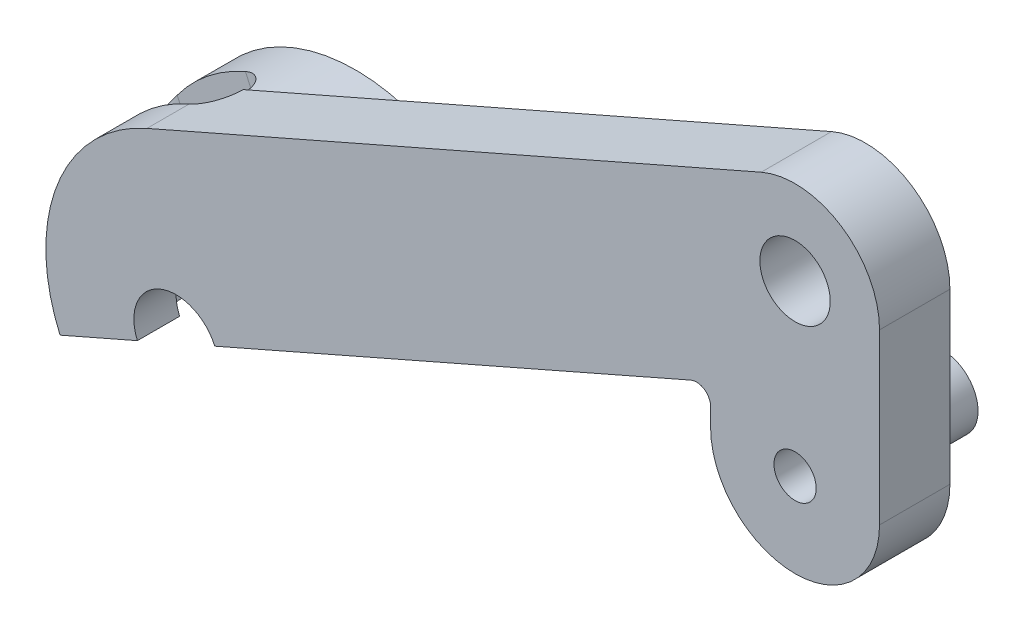
ISO-10303-21;
HEADER;
FILE_DESCRIPTION(('STEP AP214'),'2;1');
FILE_NAME('part.step','',(''),(''),'','','');
FILE_SCHEMA(('AUTOMOTIVE_DESIGN { 1 0 10303 214 1 1 1 1 }'));
ENDSEC;
DATA;
#1=APPLICATION_CONTEXT('core data for automotive mechanical design processes');
#2=APPLICATION_PROTOCOL_DEFINITION('international standard','automotive_design',2000,#1);
#3=PRODUCT_CONTEXT('',#1,'mechanical');
#4=PRODUCT('Part','Part','',(#3));
#5=PRODUCT_RELATED_PRODUCT_CATEGORY('part','',(#4));
#6=PRODUCT_DEFINITION_FORMATION('','',#4);
#7=PRODUCT_DEFINITION_CONTEXT('part definition',#1,'design');
#8=PRODUCT_DEFINITION('design','',#6,#7);
#9=PRODUCT_DEFINITION_SHAPE('','',#8);
#10=(LENGTH_UNIT() NAMED_UNIT(*) SI_UNIT(.MILLI.,.METRE.));
#11=(NAMED_UNIT(*) PLANE_ANGLE_UNIT() SI_UNIT($,.RADIAN.));
#12=(NAMED_UNIT(*) SI_UNIT($,.STERADIAN.) SOLID_ANGLE_UNIT());
#13=UNCERTAINTY_MEASURE_WITH_UNIT(LENGTH_MEASURE(1.E-05),#10,'distance_accuracy_value','');
#14=(GEOMETRIC_REPRESENTATION_CONTEXT(3) GLOBAL_UNCERTAINTY_ASSIGNED_CONTEXT((#13)) GLOBAL_UNIT_ASSIGNED_CONTEXT((#10,
#11,#12)) REPRESENTATION_CONTEXT('',''));
#15=CARTESIAN_POINT('',(0.,0.,0.));
#16=DIRECTION('',(0.,0.,1.));
#17=DIRECTION('',(1.,0.,0.));
#18=AXIS2_PLACEMENT_3D('',#15,#16,#17);
#19=CARTESIAN_POINT('',(0.,0.,0.));
#20=DIRECTION('',(0.,0.,1.));
#21=DIRECTION('',(1.,0.,0.));
#22=AXIS2_PLACEMENT_3D('',#19,#20,#21);
#23=PLANE('',#22);
#24=CARTESIAN_POINT('',(-41.2219418290661,-24.6147665054727,0.));
#25=DIRECTION('',(0.,0.,-1.));
#26=DIRECTION('',(-1.,0.,0.));
#27=AXIS2_PLACEMENT_3D('',#24,#25,#26);
#28=CIRCLE('',#27,12.);
#29=CARTESIAN_POINT('',(-44.1391367300986,-12.9747504440838,0.));
#30=VERTEX_POINT('',#29);
#31=CARTESIAN_POINT('',(-30.230930363282,-19.7983708656813,0.));
#32=VERTEX_POINT('',#31);
#33=EDGE_CURVE('E220',#30,#32,#28,.T.);
#34=ORIENTED_EDGE('',*,*,#33,.F.);
#35=DIRECTION('',(-0.401366303315951,0.915917622148678,0.));
#36=VECTOR('',#35,1.);
#37=CARTESIAN_POINT('',(-37.784641371505,-27.4757043874355,0.));
#38=LINE('',#37,#36);
#39=CARTESIAN_POINT('',(-44.2065022245602,-12.8210224330566,0.));
#40=VERTEX_POINT('',#39);
#41=EDGE_CURVE('E327',#30,#40,#38,.T.);
#42=ORIENTED_EDGE('',*,*,#41,.T.);
#43=DIRECTION('',(-0.915917622148678,-0.401366303315951,0.));
#44=VECTOR('',#43,1.);
#45=CARTESIAN_POINT('',(-2.40819781989571,5.49550573289207,0.));
#46=LINE('',#45,#44);
#47=CARTESIAN_POINT('',(-2.40819781989571,5.49550573289207,0.));
#48=VERTEX_POINT('',#47);
#49=EDGE_CURVE('E165',#48,#40,#46,.T.);
#50=ORIENTED_EDGE('',*,*,#49,.F.);
#51=CARTESIAN_POINT('',(0.,0.,0.));
#52=DIRECTION('',(0.,0.,1.));
#53=DIRECTION('',(1.,0.,0.));
#54=AXIS2_PLACEMENT_3D('',#51,#52,#53);
#55=CIRCLE('',#54,6.);
#56=CARTESIAN_POINT('',(6.,0.,0.));
#57=VERTEX_POINT('',#56);
#58=EDGE_CURVE('E250',#57,#48,#55,.T.);
#59=ORIENTED_EDGE('',*,*,#58,.F.);
#60=DIRECTION('',(0.,1.,0.));
#61=VECTOR('',#60,1.);
#62=CARTESIAN_POINT('',(6.,0.,0.));
#63=LINE('',#62,#61);
#64=CARTESIAN_POINT('',(5.99999999999999,-12.,0.));
#65=VERTEX_POINT('',#64);
#66=EDGE_CURVE('E257',#65,#57,#63,.T.);
#67=ORIENTED_EDGE('',*,*,#66,.F.);
#68=CARTESIAN_POINT('',(0.,-12.,0.));
#69=DIRECTION('',(0.,0.,1.));
#70=DIRECTION('',(1.,0.,0.));
#71=AXIS2_PLACEMENT_3D('',#68,#69,#70);
#72=CIRCLE('',#71,5.99999999999999);
#73=CARTESIAN_POINT('',(-5.99999999999999,-12.0000000000001,0.));
#74=VERTEX_POINT('',#73);
#75=EDGE_CURVE('E284',#74,#65,#72,.T.);
#76=ORIENTED_EDGE('',*,*,#75,.F.);
#77=DIRECTION('',(0.,-1.,0.));
#78=VECTOR('',#77,1.);
#79=CARTESIAN_POINT('',(-5.99999999999999,-10.7100943207089,0.));
#80=LINE('',#79,#78);
#81=CARTESIAN_POINT('',(-5.99999999999999,-10.7100943207089,0.));
#82=VERTEX_POINT('',#81);
#83=EDGE_CURVE('E282',#82,#74,#80,.T.);
#84=ORIENTED_EDGE('',*,*,#83,.F.);
#85=CARTESIAN_POINT('',(-6.99999999999999,-10.7100943207088,0.));
#86=DIRECTION('',(0.,0.,-1.));
#87=DIRECTION('',(1.,0.,0.));
#88=AXIS2_PLACEMENT_3D('',#85,#86,#87);
#89=CIRCLE('',#88,1.);
#90=CARTESIAN_POINT('',(-7.40136630331595,-9.79417669856016,0.));
#91=VERTEX_POINT('',#90);
#92=EDGE_CURVE('E280',#91,#82,#89,.T.);
#93=ORIENTED_EDGE('',*,*,#92,.F.);
#94=DIRECTION('',(0.915917622148678,0.40136630331595,0.));
#95=VECTOR('',#94,1.);
#96=CARTESIAN_POINT('',(-7.40136630331595,-9.79417669856016,0.));
#97=LINE('',#96,#95);
#98=EDGE_CURVE('E278',#32,#91,#97,.T.);
#99=ORIENTED_EDGE('',*,*,#98,.F.);
#100=EDGE_LOOP('',(#34,#42,#50,#59,#67,#76,#84,#93,#99));
#101=FACE_BOUND('',#100,.T.);
#102=CARTESIAN_POINT('',(0.,0.,0.));
#103=DIRECTION('',(0.,0.,1.));
#104=DIRECTION('',(1.,0.,0.));
#105=AXIS2_PLACEMENT_3D('',#102,#103,#104);
#106=CIRCLE('',#105,2.5);
#107=CARTESIAN_POINT('',(2.5,0.,0.));
#108=VERTEX_POINT('',#107);
#109=EDGE_CURVE('E246',#108,#108,#106,.T.);
#110=ORIENTED_EDGE('',*,*,#109,.T.);
#111=EDGE_LOOP('',(#110));
#112=FACE_BOUND('',#111,.T.);
#113=CARTESIAN_POINT('',(0.,-12.,0.));
#114=DIRECTION('',(0.,0.,1.));
#115=DIRECTION('',(1.,0.,0.));
#116=AXIS2_PLACEMENT_3D('',#113,#114,#115);
#117=CIRCLE('',#116,3.5);
#118=CARTESIAN_POINT('',(3.5,-12.,0.));
#119=VERTEX_POINT('',#118);
#120=EDGE_CURVE('E11',#119,#119,#117,.F.);
#121=ORIENTED_EDGE('',*,*,#120,.F.);
#122=EDGE_LOOP('',(#121));
#123=FACE_BOUND('',#122,.T.);
#124=ADVANCED_FACE('F30',(#101,#112,#123),#23,.F.);
#125=CARTESIAN_POINT('',(-43.9696946955122,-25.8188654154205,5.));
#126=DIRECTION('',(0.,0.,-1.));
#127=DIRECTION('',(-1.,0.,0.));
#128=AXIS2_PLACEMENT_3D('',#125,#126,#127);
#129=CYLINDRICAL_SURFACE('',#128,3.);
#130=DIRECTION('',(0.,0.,-1.));
#131=VECTOR('',#130,1.);
#132=CARTESIAN_POINT('',(-46.7174475619582,-27.0229643253684,5.));
#133=LINE('',#132,#131);
#134=CARTESIAN_POINT('',(-46.7174475619582,-27.0229643253684,5.));
#135=VERTEX_POINT('',#134);
#136=CARTESIAN_POINT('',(-46.7174475619582,-27.0229643253684,2.));
#137=VERTEX_POINT('',#136);
#138=EDGE_CURVE('E176',#135,#137,#133,.T.);
#139=ORIENTED_EDGE('',*,*,#138,.T.);
#140=CARTESIAN_POINT('',(-43.9696946955122,-25.8188654154205,2.));
#141=DIRECTION('',(0.,0.,1.));
#142=DIRECTION('',(1.,0.,0.));
#143=AXIS2_PLACEMENT_3D('',#140,#141,#142);
#144=CIRCLE('',#143,3.);
#145=CARTESIAN_POINT('',(-41.2219418290661,-24.6147665054727,2.));
#146=VERTEX_POINT('',#145);
#147=EDGE_CURVE('E149',#137,#146,#144,.F.);
#148=ORIENTED_EDGE('',*,*,#147,.T.);
#149=DIRECTION('',(0.,0.,-1.));
#150=VECTOR('',#149,1.);
#151=CARTESIAN_POINT('',(-41.2219418290661,-24.6147665054727,5.));
#152=LINE('',#151,#150);
#153=CARTESIAN_POINT('',(-41.2219418290661,-24.6147665054727,5.));
#154=VERTEX_POINT('',#153);
#155=EDGE_CURVE('E188',#154,#146,#152,.T.);
#156=ORIENTED_EDGE('',*,*,#155,.F.);
#157=CARTESIAN_POINT('',(-43.9696946955122,-25.8188654154205,5.));
#158=DIRECTION('',(0.,0.,-1.));
#159=DIRECTION('',(1.,0.,0.));
#160=AXIS2_PLACEMENT_3D('',#157,#158,#159);
#161=CIRCLE('',#160,3.);
#162=EDGE_CURVE('E262',#135,#154,#161,.T.);
#163=ORIENTED_EDGE('',*,*,#162,.F.);
#164=EDGE_LOOP('',(#139,#148,#156,#163));
#165=FACE_BOUND('',#164,.T.);
#166=ADVANCED_FACE('F366',(#165),#129,.F.);
#167=CARTESIAN_POINT('',(0.,0.,5.));
#168=DIRECTION('',(0.,0.,1.));
#169=DIRECTION('',(1.,0.,0.));
#170=AXIS2_PLACEMENT_3D('',#167,#168,#169);
#171=PLANE('',#170);
#172=CARTESIAN_POINT('',(0.,-12.,5.));
#173=DIRECTION('',(0.,0.,1.));
#174=DIRECTION('',(1.,0.,0.));
#175=AXIS2_PLACEMENT_3D('',#172,#173,#174);
#176=CIRCLE('',#175,1.5);
#177=CARTESIAN_POINT('',(1.5,-12.,5.));
#178=VERTEX_POINT('',#177);
#179=EDGE_CURVE('E240',#178,#178,#176,.T.);
#180=ORIENTED_EDGE('',*,*,#179,.F.);
#181=EDGE_LOOP('',(#180));
#182=FACE_BOUND('',#181,.T.);
#183=CARTESIAN_POINT('',(0.,0.,5.));
#184=DIRECTION('',(0.,0.,1.));
#185=DIRECTION('',(1.,0.,0.));
#186=AXIS2_PLACEMENT_3D('',#183,#184,#185);
#187=CIRCLE('',#186,6.);
#188=CARTESIAN_POINT('',(6.,0.,5.));
#189=VERTEX_POINT('',#188);
#190=CARTESIAN_POINT('',(-2.40819781989571,5.49550573289207,5.));
#191=VERTEX_POINT('',#190);
#192=EDGE_CURVE('E253',#189,#191,#187,.T.);
#193=ORIENTED_EDGE('',*,*,#192,.T.);
#194=DIRECTION('',(-0.915917622148678,-0.401366303315951,0.));
#195=VECTOR('',#194,1.);
#196=CARTESIAN_POINT('',(-2.40819781989571,5.49550573289207,5.));
#197=LINE('',#196,#195);
#198=CARTESIAN_POINT('',(-46.0383374688576,-13.6237550396885,5.));
#199=VERTEX_POINT('',#198);
#200=EDGE_CURVE('E256',#191,#199,#197,.T.);
#201=ORIENTED_EDGE('',*,*,#200,.T.);
#202=CARTESIAN_POINT('',(-41.2219418290661,-24.6147665054727,5.));
#203=DIRECTION('',(0.,0.,1.));
#204=DIRECTION('',(1.,0.,0.));
#205=AXIS2_PLACEMENT_3D('',#202,#203,#204);
#206=CIRCLE('',#205,12.);
#207=CARTESIAN_POINT('',(-52.2129532948503,-29.4311621452641,5.));
#208=VERTEX_POINT('',#207);
#209=EDGE_CURVE('E171',#199,#208,#206,.T.);
#210=ORIENTED_EDGE('',*,*,#209,.T.);
#211=DIRECTION('',(0.915917622148679,0.401366303315949,0.));
#212=VECTOR('',#211,1.);
#213=CARTESIAN_POINT('',(-46.7174475619582,-27.0229643253684,5.));
#214=LINE('',#213,#212);
#215=EDGE_CURVE('E260',#208,#135,#214,.T.);
#216=ORIENTED_EDGE('',*,*,#215,.T.);
#217=ORIENTED_EDGE('',*,*,#162,.T.);
#218=DIRECTION('',(0.915917622148678,0.40136630331595,0.));
#219=VECTOR('',#218,1.);
#220=CARTESIAN_POINT('',(-7.40136630331595,-9.79417669856016,5.));
#221=LINE('',#220,#219);
#222=CARTESIAN_POINT('',(-7.40136630331595,-9.79417669856016,5.));
#223=VERTEX_POINT('',#222);
#224=EDGE_CURVE('E264',#154,#223,#221,.T.);
#225=ORIENTED_EDGE('',*,*,#224,.T.);
#226=CARTESIAN_POINT('',(-6.99999999999999,-10.7100943207088,5.));
#227=DIRECTION('',(0.,0.,-1.));
#228=DIRECTION('',(1.,0.,0.));
#229=AXIS2_PLACEMENT_3D('',#226,#227,#228);
#230=CIRCLE('',#229,1.);
#231=CARTESIAN_POINT('',(-5.99999999999999,-10.7100943207089,5.));
#232=VERTEX_POINT('',#231);
#233=EDGE_CURVE('E266',#223,#232,#230,.T.);
#234=ORIENTED_EDGE('',*,*,#233,.T.);
#235=DIRECTION('',(0.,-1.,0.));
#236=VECTOR('',#235,1.);
#237=CARTESIAN_POINT('',(-5.99999999999999,-10.7100943207089,5.));
#238=LINE('',#237,#236);
#239=CARTESIAN_POINT('',(-5.99999999999999,-12.0000000000001,5.));
#240=VERTEX_POINT('',#239);
#241=EDGE_CURVE('E268',#232,#240,#238,.T.);
#242=ORIENTED_EDGE('',*,*,#241,.T.);
#243=CARTESIAN_POINT('',(0.,-12.,5.));
#244=DIRECTION('',(0.,0.,1.));
#245=DIRECTION('',(1.,0.,0.));
#246=AXIS2_PLACEMENT_3D('',#243,#244,#245);
#247=CIRCLE('',#246,5.99999999999999);
#248=CARTESIAN_POINT('',(5.99999999999999,-12.,5.));
#249=VERTEX_POINT('',#248);
#250=EDGE_CURVE('E270',#240,#249,#247,.T.);
#251=ORIENTED_EDGE('',*,*,#250,.T.);
#252=DIRECTION('',(0.,1.,0.));
#253=VECTOR('',#252,1.);
#254=CARTESIAN_POINT('',(6.,0.,5.));
#255=LINE('',#254,#253);
#256=EDGE_CURVE('E272',#249,#189,#255,.T.);
#257=ORIENTED_EDGE('',*,*,#256,.T.);
#258=EDGE_LOOP('',(#193,#201,#210,#216,#217,#225,#234,#242,#251,#257));
#259=FACE_BOUND('',#258,.T.);
#260=CARTESIAN_POINT('',(0.,0.,5.));
#261=DIRECTION('',(0.,0.,1.));
#262=DIRECTION('',(1.,0.,0.));
#263=AXIS2_PLACEMENT_3D('',#260,#261,#262);
#264=CIRCLE('',#263,2.5);
#265=CARTESIAN_POINT('',(2.5,0.,5.));
#266=VERTEX_POINT('',#265);
#267=EDGE_CURVE('E247',#266,#266,#264,.T.);
#268=ORIENTED_EDGE('',*,*,#267,.F.);
#269=EDGE_LOOP('',(#268));
#270=FACE_BOUND('',#269,.T.);
#271=ADVANCED_FACE('F321',(#182,#259,#270),#171,.T.);
#272=CARTESIAN_POINT('',(0.,0.,5.));
#273=DIRECTION('',(0.,0.,-1.));
#274=DIRECTION('',(-1.,0.,0.));
#275=AXIS2_PLACEMENT_3D('',#272,#273,#274);
#276=CYLINDRICAL_SURFACE('',#275,6.);
#277=ORIENTED_EDGE('',*,*,#58,.T.);
#278=DIRECTION('',(0.,0.,-1.));
#279=VECTOR('',#278,1.);
#280=CARTESIAN_POINT('',(-2.40819781989571,5.49550573289207,5.));
#281=LINE('',#280,#279);
#282=EDGE_CURVE('E172',#191,#48,#281,.T.);
#283=ORIENTED_EDGE('',*,*,#282,.F.);
#284=ORIENTED_EDGE('',*,*,#192,.F.);
#285=DIRECTION('',(0.,0.,-1.));
#286=VECTOR('',#285,1.);
#287=CARTESIAN_POINT('',(6.,0.,5.));
#288=LINE('',#287,#286);
#289=EDGE_CURVE('E274',#189,#57,#288,.T.);
#290=ORIENTED_EDGE('',*,*,#289,.T.);
#291=EDGE_LOOP('',(#277,#283,#284,#290));
#292=FACE_BOUND('',#291,.T.);
#293=ADVANCED_FACE('F32',(#292),#276,.T.);
#294=CARTESIAN_POINT('',(-2.40819781989571,5.49550573289207,5.));
#295=DIRECTION('',(0.401366303315951,-0.915917622148678,0.));
#296=DIRECTION('',(0.915917622148678,0.401366303315951,0.));
#297=AXIS2_PLACEMENT_3D('',#294,#295,#296);
#298=PLANE('',#297);
#299=ORIENTED_EDGE('',*,*,#49,.T.);
#300=CARTESIAN_POINT('',(-46.0383374688576,-13.6237550396885,0.));
#301=DIRECTION('',(-0.401366303315951,0.915917622148678,0.));
#302=DIRECTION('',(-0.915917622148678,-0.401366303315951,0.));
#303=AXIS2_PLACEMENT_3D('',#300,#301,#302);
#304=CIRCLE('',#303,2.);
#305=CARTESIAN_POINT('',(-46.0383374688576,-13.6237550396885,2.));
#306=VERTEX_POINT('',#305);
#307=EDGE_CURVE('E153',#306,#40,#304,.T.);
#308=ORIENTED_EDGE('',*,*,#307,.F.);
#309=DIRECTION('',(0.,0.,-1.));
#310=VECTOR('',#309,1.);
#311=CARTESIAN_POINT('',(-46.0383374688576,-13.6237550396885,5.));
#312=LINE('',#311,#310);
#313=EDGE_CURVE('E162',#199,#306,#312,.T.);
#314=ORIENTED_EDGE('',*,*,#313,.F.);
#315=ORIENTED_EDGE('',*,*,#200,.F.);
#316=ORIENTED_EDGE('',*,*,#282,.T.);
#317=EDGE_LOOP('',(#299,#308,#314,#315,#316));
#318=FACE_BOUND('',#317,.T.);
#319=ADVANCED_FACE('F161',(#318),#298,.F.);
#320=CARTESIAN_POINT('',(-41.2219418290661,-24.6147665054727,5.));
#321=DIRECTION('',(0.,0.,-1.));
#322=DIRECTION('',(-1.,0.,0.));
#323=AXIS2_PLACEMENT_3D('',#320,#321,#322);
#324=CYLINDRICAL_SURFACE('',#323,12.);
#325=CARTESIAN_POINT('',(-41.2219418290661,-24.6147665054727,-2.));
#326=DIRECTION('',(0.,0.,-1.));
#327=DIRECTION('',(-1.,0.,0.));
#328=AXIS2_PLACEMENT_3D('',#325,#326,#327);
#329=CIRCLE('',#328,12.);
#330=CARTESIAN_POINT('',(-50.8885685406942,-17.5044691827133,-2.));
#331=VERTEX_POINT('',#330);
#332=CARTESIAN_POINT('',(-46.0383374688576,-13.6237550396885,-2.));
#333=VERTEX_POINT('',#332);
#334=EDGE_CURVE('E329',#331,#333,#329,.T.);
#335=ORIENTED_EDGE('',*,*,#334,.T.);
#336=CARTESIAN_POINT('',(-46.0383374688576,-13.6237550396885,-2.));
#337=CARTESIAN_POINT('',(-45.987177956505,-13.6013339509424,-2.00000007728029));
#338=CARTESIAN_POINT('',(-45.935884823664,-13.5792853732005,-1.99765851952151));
#339=CARTESIAN_POINT('',(-45.8333635529989,-13.5360537146586,-1.98832005299379));
#340=CARTESIAN_POINT('',(-45.7821354093213,-13.5148705496192,-1.98132359848445));
#341=CARTESIAN_POINT('',(-45.6292507095027,-13.45288219623,-1.95343303224241));
#342=CARTESIAN_POINT('',(-45.5281715132909,-13.4135409163082,-1.9256374378508));
#343=CARTESIAN_POINT('',(-45.3307835944726,-13.3396362397797,-1.85246899212945));
#344=CARTESIAN_POINT('',(-45.2344759791481,-13.3050739488726,-1.80709208226902));
#345=CARTESIAN_POINT('',(-45.0494670779885,-13.2411288683285,-1.70007782418194));
#346=CARTESIAN_POINT('',(-44.9607658369877,-13.2117461092201,-1.6384403801197));
#347=CARTESIAN_POINT('',(-44.7929544566566,-13.1580780413513,-1.50003918943174));
#348=CARTESIAN_POINT('',(-44.7139316714564,-13.1338378918573,-1.42315205731317));
#349=CARTESIAN_POINT('',(-44.5688239766661,-13.0906993592753,-1.25669021891864));
#350=CARTESIAN_POINT('',(-44.5027411204567,-13.0718018237727,-1.16711350286858));
#351=CARTESIAN_POINT('',(-44.3853257109925,-13.0390698171661,-0.97714048198095));
#352=CARTESIAN_POINT('',(-44.3340861644276,-13.0252671281945,-0.876681154021439));
#353=CARTESIAN_POINT('',(-44.2486930698734,-13.0026719477008,-0.668226147293591));
#354=CARTESIAN_POINT('',(-44.2145373902094,-12.9938788310799,-0.560231410688554));
#355=CARTESIAN_POINT('',(-44.1647815264495,-12.9811791648683,-0.340817086957531));
#356=CARTESIAN_POINT('',(-44.1490137755275,-12.9772284697363,-0.229438072838191));
#357=CARTESIAN_POINT('',(-44.1360548050524,-12.9739764497039,-0.00553846548185121));
#358=CARTESIAN_POINT('',(-44.1388627129436,-12.9746749064186,0.106982073886306));
#359=CARTESIAN_POINT('',(-44.1628219355026,-12.9807057527947,0.32874264314263));
#360=CARTESIAN_POINT('',(-44.1837836937256,-12.9859902576428,0.438004541756113));
#361=CARTESIAN_POINT('',(-44.24303714658,-13.0012437557399,0.651377719006778));
#362=CARTESIAN_POINT('',(-44.2813293252236,-13.0112128798234,0.755488853700875));
#363=CARTESIAN_POINT('',(-44.374139353961,-13.0360809927826,0.956184931600344));
#364=CARTESIAN_POINT('',(-44.4287346294665,-13.051003544708,1.05273112208769));
#365=CARTESIAN_POINT('',(-44.5522652764567,-13.0859741469136,1.23512673807788));
#366=CARTESIAN_POINT('',(-44.6212012716148,-13.1060224201185,1.32097569810164));
#367=CARTESIAN_POINT('',(-44.7721504658695,-13.1516823219239,1.48064976798112));
#368=CARTESIAN_POINT('',(-44.8543137613265,-13.1773592024011,1.55431439856376));
#369=CARTESIAN_POINT('',(-45.028547628671,-13.2341631525881,1.68628614280427));
#370=CARTESIAN_POINT('',(-45.1206209874677,-13.2652917569841,1.74458892042259));
#371=CARTESIAN_POINT('',(-45.3119313330901,-13.3328212141087,1.84419672726241));
#372=CARTESIAN_POINT('',(-45.4111782198618,-13.3692294255156,1.88547771779019));
#373=CARTESIAN_POINT('',(-45.6136162941685,-13.4467369560765,1.94962892777016));
#374=CARTESIAN_POINT('',(-45.716801365101,-13.4878291828543,1.972526570668));
#375=CARTESIAN_POINT('',(-45.8566556359106,-13.5458461498197,1.99060413339658));
#376=CARTESIAN_POINT('',(-45.8930562822045,-13.5611580167574,1.9941290649705));
#377=CARTESIAN_POINT('',(-45.9657712096149,-13.5921698711814,1.99882392771952));
#378=CARTESIAN_POINT('',(-46.0020855327152,-13.6078691588988,1.99999782937896));
#379=CARTESIAN_POINT('',(-46.0383374688576,-13.6237550396885,2.));
#380=B_SPLINE_CURVE_WITH_KNOTS('',3,(#336,#337,#338,#339,#340,#341,#342,#343,#344,#345,#346,
#347,#348,#349,#350,#351,#352,#353,#354,#355,#356,#357,#358,#359,#360,#361,#362,#363,#364,#365,
#366,#367,#368,#369,#370,#371,#372,#373,#374,#375,#376,#377,#378,#379),.UNSPECIFIED.,.F.,.F.,(4,
2,2,2,2,2,2,2,2,2,2,2,2,2,2,2,2,2,2,2,2,4),(0.,0.167466793476613,0.334917246689121,
0.669099418981877,1.003358781031,1.33762011316667,1.67470522507313,2.01184378427361,
2.35105125919959,2.69021639824863,3.02626600059654,3.3622998177762,3.69486661625036,
4.027442703382,4.36162405769656,4.69581994849793,5.03411693896798,5.37250931516627,
5.7113779561908,6.04974014412253,6.16862730319591,6.28731351246371),.UNSPECIFIED.);
#381=EDGE_CURVE('E148',#333,#30,#380,.T.);
#382=ORIENTED_EDGE('',*,*,#381,.T.);
#383=ORIENTED_EDGE('',*,*,#33,.T.);
#384=DIRECTION('',(0.,0.,1.));
#385=VECTOR('',#384,1.);
#386=CARTESIAN_POINT('',(-30.230930363282,-19.7983708656813,-5.));
#387=LINE('',#386,#385);
#388=CARTESIAN_POINT('',(-30.230930363282,-19.7983708656813,-5.));
#389=VERTEX_POINT('',#388);
#390=EDGE_CURVE('E233',#389,#32,#387,.T.);
#391=ORIENTED_EDGE('',*,*,#390,.F.);
#392=CARTESIAN_POINT('',(-41.2219418290661,-24.6147665054727,-5.));
#393=DIRECTION('',(0.,0.,-1.));
#394=DIRECTION('',(-1.,0.,0.));
#395=AXIS2_PLACEMENT_3D('',#392,#393,#394);
#396=CIRCLE('',#395,12.);
#397=CARTESIAN_POINT('',(-52.2129532948503,-29.4311621452641,-5.));
#398=VERTEX_POINT('',#397);
#399=EDGE_CURVE('E216',#398,#389,#396,.T.);
#400=ORIENTED_EDGE('',*,*,#399,.F.);
#401=DIRECTION('',(0.,0.,-1.));
#402=VECTOR('',#401,1.);
#403=CARTESIAN_POINT('',(-52.2129532948503,-29.4311621452641,5.));
#404=LINE('',#403,#402);
#405=EDGE_CURVE('E173',#208,#398,#404,.T.);
#406=ORIENTED_EDGE('',*,*,#405,.F.);
#407=ORIENTED_EDGE('',*,*,#209,.F.);
#408=ORIENTED_EDGE('',*,*,#313,.T.);
#409=CARTESIAN_POINT('',(-41.2219418290661,-24.6147665054727,2.));
#410=DIRECTION('',(0.,0.,1.));
#411=DIRECTION('',(1.,0.,0.));
#412=AXIS2_PLACEMENT_3D('',#409,#410,#411);
#413=CIRCLE('',#412,12.);
#414=CARTESIAN_POINT('',(-50.8885685406942,-17.5044691827133,2.));
#415=VERTEX_POINT('',#414);
#416=EDGE_CURVE('E138',#306,#415,#413,.T.);
#417=ORIENTED_EDGE('',*,*,#416,.T.);
#418=CARTESIAN_POINT('',(-50.8885685406942,-17.5044691827133,2.));
#419=CARTESIAN_POINT('',(-50.9391043585611,-17.5731563833617,1.99999637013235));
#420=CARTESIAN_POINT('',(-50.9888748394552,-17.6423717048843,1.99590970320728));
#421=CARTESIAN_POINT('',(-51.0865065708279,-17.7812098341508,1.97986188562703));
#422=CARTESIAN_POINT('',(-51.1343683525824,-17.8508325222312,1.96790294263227));
#423=CARTESIAN_POINT('',(-51.2279538011934,-17.9900557470651,1.93636107787008));
#424=CARTESIAN_POINT('',(-51.2736716146509,-18.0596557602736,1.91675850727208));
#425=CARTESIAN_POINT('',(-51.3625433944191,-18.197994017551,1.8701881620852));
#426=CARTESIAN_POINT('',(-51.4056973958417,-18.2667322734118,1.84322048839183));
#427=CARTESIAN_POINT('',(-51.5225991129155,-18.4570891519447,1.75767754986114));
#428=CARTESIAN_POINT('',(-51.5932602530941,-18.5771042378419,1.69105844273576));
#429=CARTESIAN_POINT('',(-51.7241286796633,-18.8077347032567,1.53537115645926));
#430=CARTESIAN_POINT('',(-51.7843523149198,-18.918364641913,1.44633863125721));
#431=CARTESIAN_POINT('',(-51.8791387713982,-19.098269191139,1.27163021147799));
#432=CARTESIAN_POINT('',(-51.9163339058209,-19.1709102160806,1.19084698992406));
#433=CARTESIAN_POINT('',(-51.9832433321,-19.3044044105575,1.01731839226016));
#434=CARTESIAN_POINT('',(-52.0129691593276,-19.3652757229435,0.924591800365272));
#435=CARTESIAN_POINT('',(-52.0590001782206,-19.4610834880161,0.74693944008822));
#436=CARTESIAN_POINT('',(-52.0767820130786,-19.4987498783388,0.66387668627535));
#437=CARTESIAN_POINT('',(-52.1060255539712,-19.5612606623921,0.491979331107719));
#438=CARTESIAN_POINT('',(-52.1174918800221,-19.5861144281529,0.403149002258174));
#439=CARTESIAN_POINT('',(-52.1335593714654,-19.6210714652146,0.221430514468119));
#440=CARTESIAN_POINT('',(-52.1381202575231,-19.6310881849431,0.128521775639164));
#441=CARTESIAN_POINT('',(-52.1399549137166,-19.6351079870193,-0.0577062520767847));
#442=CARTESIAN_POINT('',(-52.1372305187726,-19.6291151016554,-0.151025431676864));
#443=CARTESIAN_POINT('',(-52.1252653769084,-19.6030099572491,-0.326283697920225));
#444=CARTESIAN_POINT('',(-52.1166520408258,-19.5842579184879,-0.408475856485106));
#445=CARTESIAN_POINT('',(-52.0939912098404,-19.5354691181385,-0.568627160924103));
#446=CARTESIAN_POINT('',(-52.0799413023248,-19.5054273466236,-0.646584409912217));
#447=CARTESIAN_POINT('',(-52.0416774731421,-19.4247882265486,-0.82078239544396));
#448=CARTESIAN_POINT('',(-52.0156542825459,-19.3706946696265,-0.915006329869391));
#449=CARTESIAN_POINT('',(-51.9561701420739,-19.2499851336775,-1.09245325153825));
#450=CARTESIAN_POINT('',(-51.9226956321047,-19.1833463591061,-1.17565573564963));
#451=CARTESIAN_POINT('',(-51.8391887847004,-19.0215188018978,-1.35159478175195));
#452=CARTESIAN_POINT('',(-51.7871297793764,-18.9234968640718,-1.44075856968483));
#453=CARTESIAN_POINT('',(-51.6737454932374,-18.7178497682273,-1.60006797070475));
#454=CARTESIAN_POINT('',(-51.6124104772306,-18.6102145702472,-1.67019338426703));
#455=CARTESIAN_POINT('',(-51.4806849132201,-18.3877994095378,-1.79179443721624));
#456=CARTESIAN_POINT('',(-51.4101873537488,-18.2729449562473,-1.8430167240752));
#457=CARTESIAN_POINT('',(-51.261935764534,-18.0407710631305,-1.92463550361569));
#458=CARTESIAN_POINT('',(-51.1841952511905,-17.9234565192381,-1.9550699386265));
#459=CARTESIAN_POINT('',(-51.0687163806205,-17.7558426554204,-1.9829533797816));
#460=CARTESIAN_POINT('',(-51.0333147023989,-17.705295564889,-1.98931998176326));
#461=CARTESIAN_POINT('',(-50.9616000883088,-17.6045685686209,-1.99783957042602));
#462=CARTESIAN_POINT('',(-50.9252880631206,-17.5543883560758,-1.99999661023927));
#463=CARTESIAN_POINT('',(-50.8885685406942,-17.5044691827133,-2.));
#464=B_SPLINE_CURVE_WITH_KNOTS('',3,(#418,#419,#420,#421,#422,#423,#424,#425,#426,#427,#428,
#429,#430,#431,#432,#433,#434,#435,#436,#437,#438,#439,#440,#441,#442,#443,#444,#445,#446,#447,
#448,#449,#450,#451,#452,#453,#454,#455,#456,#457,#458,#459,#460,#461,#462,#463),.UNSPECIFIED.,
.F.,.F.,(4,2,2,2,2,2,2,2,2,2,2,2,2,2,2,2,2,2,2,2,2,2,4),(0.,0.255680498651256,0.511289326113024,
0.767559604031979,1.02382637144694,1.48472594998579,1.94489693888569,2.28817092697037,
2.63091146890204,2.90855953585143,3.18600422280982,3.4650610890819,3.74404767681807,
3.9971748504014,4.2504144844804,4.58375856782749,4.91771431173812,5.34260307535484,
5.76794089542103,6.19878845598641,6.6288475098969,6.81483838230515,7.00065008685469),.UNSPECIFIED.);
#465=EDGE_CURVE('E222',#415,#331,#464,.T.);
#466=ORIENTED_EDGE('',*,*,#465,.T.);
#467=EDGE_LOOP('',(#335,#382,#383,#391,#400,#406,#407,#408,#417,#466));
#468=FACE_BOUND('',#467,.T.);
#469=ADVANCED_FACE('F169',(#468),#324,.T.);
#470=CARTESIAN_POINT('',(-46.7174475619582,-27.0229643253684,5.));
#471=DIRECTION('',(-0.401366303315949,0.915917622148679,0.));
#472=DIRECTION('',(-0.915917622148679,-0.401366303315949,0.));
#473=AXIS2_PLACEMENT_3D('',#470,#471,#472);
#474=PLANE('',#473);
#475=CARTESIAN_POINT('',(-46.7174475619582,-27.0229643253684,-2.));
#476=VERTEX_POINT('',#475);
#477=CARTESIAN_POINT('',(-46.7174475619582,-27.0229643253684,-5.));
#478=VERTEX_POINT('',#477);
#479=EDGE_CURVE('E198',#476,#478,#133,.T.);
#480=ORIENTED_EDGE('',*,*,#479,.F.);
#481=CARTESIAN_POINT('',(-46.7174475619582,-27.0229643253684,0.));
#482=DIRECTION('',(-0.401366303315949,0.915917622148679,0.));
#483=DIRECTION('',(-0.915917622148679,-0.401366303315949,0.));
#484=AXIS2_PLACEMENT_3D('',#481,#482,#483);
#485=CIRCLE('',#484,2.);
#486=EDGE_CURVE('E331',#476,#137,#485,.T.);
#487=ORIENTED_EDGE('',*,*,#486,.T.);
#488=ORIENTED_EDGE('',*,*,#138,.F.);
#489=ORIENTED_EDGE('',*,*,#215,.F.);
#490=ORIENTED_EDGE('',*,*,#405,.T.);
#491=DIRECTION('',(-0.915917622148679,-0.401366303315949,0.));
#492=VECTOR('',#491,1.);
#493=CARTESIAN_POINT('',(-46.7174475619582,-27.0229643253684,-5.));
#494=LINE('',#493,#492);
#495=EDGE_CURVE('E211',#478,#398,#494,.T.);
#496=ORIENTED_EDGE('',*,*,#495,.F.);
#497=EDGE_LOOP('',(#480,#487,#488,#489,#490,#496));
#498=FACE_BOUND('',#497,.T.);
#499=ADVANCED_FACE('F212',(#498),#474,.F.);
#500=CARTESIAN_POINT('',(-41.2219418290661,-24.6147665054727,-2.));
#501=VERTEX_POINT('',#500);
#502=CARTESIAN_POINT('',(-41.2219418290661,-24.6147665054727,-5.));
#503=VERTEX_POINT('',#502);
#504=EDGE_CURVE('E184',#501,#503,#152,.T.);
#505=ORIENTED_EDGE('',*,*,#504,.F.);
#506=CARTESIAN_POINT('',(-43.9696946955122,-25.8188654154205,-2.));
#507=DIRECTION('',(0.,0.,-1.));
#508=DIRECTION('',(-1.,0.,0.));
#509=AXIS2_PLACEMENT_3D('',#506,#507,#508);
#510=CIRCLE('',#509,3.);
#511=EDGE_CURVE('E156',#501,#476,#510,.F.);
#512=ORIENTED_EDGE('',*,*,#511,.T.);
#513=ORIENTED_EDGE('',*,*,#479,.T.);
#514=CARTESIAN_POINT('',(-43.9696946955122,-25.8188654154205,-5.));
#515=DIRECTION('',(0.,0.,1.));
#516=DIRECTION('',(-1.,0.,0.));
#517=AXIS2_PLACEMENT_3D('',#514,#515,#516);
#518=CIRCLE('',#517,3.);
#519=EDGE_CURVE('E195',#503,#478,#518,.T.);
#520=ORIENTED_EDGE('',*,*,#519,.F.);
#521=EDGE_LOOP('',(#505,#512,#513,#520));
#522=FACE_BOUND('',#521,.T.);
#523=ADVANCED_FACE('F192',(#522),#129,.F.);
#524=CARTESIAN_POINT('',(-7.40136630331595,-9.79417669856016,5.));
#525=DIRECTION('',(-0.40136630331595,0.915917622148678,0.));
#526=DIRECTION('',(-0.915917622148678,-0.40136630331595,0.));
#527=AXIS2_PLACEMENT_3D('',#524,#525,#526);
#528=PLANE('',#527);
#529=ORIENTED_EDGE('',*,*,#155,.T.);
#530=CARTESIAN_POINT('',(-41.2219418290661,-24.6147665054727,0.));
#531=DIRECTION('',(-0.40136630331595,0.915917622148678,0.));
#532=DIRECTION('',(-0.915917622148678,-0.40136630331595,0.));
#533=AXIS2_PLACEMENT_3D('',#530,#531,#532);
#534=CIRCLE('',#533,2.);
#535=EDGE_CURVE('E38',#146,#501,#534,.T.);
#536=ORIENTED_EDGE('',*,*,#535,.T.);
#537=ORIENTED_EDGE('',*,*,#504,.T.);
#538=DIRECTION('',(-0.915917622148678,-0.40136630331595,0.));
#539=VECTOR('',#538,1.);
#540=CARTESIAN_POINT('',(-41.2219418290661,-24.6147665054727,-5.));
#541=LINE('',#540,#539);
#542=EDGE_CURVE('E219',#389,#503,#541,.T.);
#543=ORIENTED_EDGE('',*,*,#542,.F.);
#544=ORIENTED_EDGE('',*,*,#390,.T.);
#545=ORIENTED_EDGE('',*,*,#98,.T.);
#546=DIRECTION('',(0.,0.,-1.));
#547=VECTOR('',#546,1.);
#548=CARTESIAN_POINT('',(-7.40136630331595,-9.79417669856016,5.));
#549=LINE('',#548,#547);
#550=EDGE_CURVE('E196',#223,#91,#549,.T.);
#551=ORIENTED_EDGE('',*,*,#550,.F.);
#552=ORIENTED_EDGE('',*,*,#224,.F.);
#553=EDGE_LOOP('',(#529,#536,#537,#543,#544,#545,#551,#552));
#554=FACE_BOUND('',#553,.T.);
#555=ADVANCED_FACE('F182',(#554),#528,.F.);
#556=CARTESIAN_POINT('',(-6.99999999999999,-10.7100943207088,5.));
#557=DIRECTION('',(0.,0.,-1.));
#558=DIRECTION('',(-1.,0.,0.));
#559=AXIS2_PLACEMENT_3D('',#556,#557,#558);
#560=CYLINDRICAL_SURFACE('',#559,1.);
#561=ORIENTED_EDGE('',*,*,#92,.T.);
#562=DIRECTION('',(0.,0.,-1.));
#563=VECTOR('',#562,1.);
#564=CARTESIAN_POINT('',(-5.99999999999999,-10.7100943207089,5.));
#565=LINE('',#564,#563);
#566=EDGE_CURVE('E200',#232,#82,#565,.T.);
#567=ORIENTED_EDGE('',*,*,#566,.F.);
#568=ORIENTED_EDGE('',*,*,#233,.F.);
#569=ORIENTED_EDGE('',*,*,#550,.T.);
#570=EDGE_LOOP('',(#561,#567,#568,#569));
#571=FACE_BOUND('',#570,.T.);
#572=ADVANCED_FACE('F325',(#571),#560,.F.);
#573=CARTESIAN_POINT('',(-5.99999999999999,-10.7100943207089,5.));
#574=DIRECTION('',(1.,0.,0.));
#575=DIRECTION('',(0.,1.,0.));
#576=AXIS2_PLACEMENT_3D('',#573,#574,#575);
#577=PLANE('',#576);
#578=ORIENTED_EDGE('',*,*,#83,.T.);
#579=DIRECTION('',(0.,0.,-1.));
#580=VECTOR('',#579,1.);
#581=CARTESIAN_POINT('',(-5.99999999999999,-12.0000000000001,5.));
#582=LINE('',#581,#580);
#583=EDGE_CURVE('E292',#240,#74,#582,.T.);
#584=ORIENTED_EDGE('',*,*,#583,.F.);
#585=ORIENTED_EDGE('',*,*,#241,.F.);
#586=ORIENTED_EDGE('',*,*,#566,.T.);
#587=EDGE_LOOP('',(#578,#584,#585,#586));
#588=FACE_BOUND('',#587,.T.);
#589=ADVANCED_FACE('F299',(#588),#577,.F.);
#590=CARTESIAN_POINT('',(0.,-12.,5.));
#591=DIRECTION('',(0.,0.,-1.));
#592=DIRECTION('',(-1.,0.,0.));
#593=AXIS2_PLACEMENT_3D('',#590,#591,#592);
#594=CYLINDRICAL_SURFACE('',#593,5.99999999999999);
#595=ORIENTED_EDGE('',*,*,#75,.T.);
#596=DIRECTION('',(0.,0.,-1.));
#597=VECTOR('',#596,1.);
#598=CARTESIAN_POINT('',(5.99999999999999,-12.,5.));
#599=LINE('',#598,#597);
#600=EDGE_CURVE('E289',#249,#65,#599,.T.);
#601=ORIENTED_EDGE('',*,*,#600,.F.);
#602=ORIENTED_EDGE('',*,*,#250,.F.);
#603=ORIENTED_EDGE('',*,*,#583,.T.);
#604=EDGE_LOOP('',(#595,#601,#602,#603));
#605=FACE_BOUND('',#604,.T.);
#606=ADVANCED_FACE('F313',(#605),#594,.T.);
#607=CARTESIAN_POINT('',(6.,0.,5.));
#608=DIRECTION('',(-1.,0.,0.));
#609=DIRECTION('',(0.,-1.,0.));
#610=AXIS2_PLACEMENT_3D('',#607,#608,#609);
#611=PLANE('',#610);
#612=ORIENTED_EDGE('',*,*,#66,.T.);
#613=ORIENTED_EDGE('',*,*,#289,.F.);
#614=ORIENTED_EDGE('',*,*,#256,.F.);
#615=ORIENTED_EDGE('',*,*,#600,.T.);
#616=EDGE_LOOP('',(#612,#613,#614,#615));
#617=FACE_BOUND('',#616,.T.);
#618=ADVANCED_FACE('F317',(#617),#611,.F.);
#619=CARTESIAN_POINT('',(0.,0.,5.));
#620=DIRECTION('',(0.,0.,-1.));
#621=DIRECTION('',(-1.,0.,0.));
#622=AXIS2_PLACEMENT_3D('',#619,#620,#621);
#623=CYLINDRICAL_SURFACE('',#622,2.5);
#624=ORIENTED_EDGE('',*,*,#267,.T.);
#625=EDGE_LOOP('',(#624));
#626=FACE_BOUND('',#625,.T.);
#627=ORIENTED_EDGE('',*,*,#109,.F.);
#628=EDGE_LOOP('',(#627));
#629=FACE_BOUND('',#628,.T.);
#630=ADVANCED_FACE('F359',(#626,#629),#623,.F.);
#631=CARTESIAN_POINT('',(0.,-12.,-5.5));
#632=DIRECTION('',(0.,0.,1.));
#633=DIRECTION('',(1.,0.,0.));
#634=AXIS2_PLACEMENT_3D('',#631,#632,#633);
#635=CYLINDRICAL_SURFACE('',#634,2.5);
#636=CARTESIAN_POINT('',(0.,-12.,-0.5));
#637=DIRECTION('',(0.,0.,-1.));
#638=DIRECTION('',(-1.,0.,0.));
#639=AXIS2_PLACEMENT_3D('',#636,#637,#638);
#640=CIRCLE('',#639,2.5);
#641=CARTESIAN_POINT('',(-2.5,-12.,-0.5));
#642=VERTEX_POINT('',#641);
#643=EDGE_CURVE('E404',#642,#642,#640,.T.);
#644=ORIENTED_EDGE('',*,*,#643,.T.);
#645=EDGE_LOOP('',(#644));
#646=FACE_BOUND('',#645,.T.);
#647=CARTESIAN_POINT('',(0.,-12.,-5.5));
#648=DIRECTION('',(0.,0.,-1.));
#649=DIRECTION('',(-1.,0.,0.));
#650=AXIS2_PLACEMENT_3D('',#647,#648,#649);
#651=CIRCLE('',#650,2.5);
#652=CARTESIAN_POINT('',(-2.5,-12.,-5.5));
#653=VERTEX_POINT('',#652);
#654=EDGE_CURVE('E243',#653,#653,#651,.T.);
#655=ORIENTED_EDGE('',*,*,#654,.F.);
#656=EDGE_LOOP('',(#655));
#657=FACE_BOUND('',#656,.T.);
#658=ADVANCED_FACE('F355',(#646,#657),#635,.T.);
#659=CARTESIAN_POINT('',(0.,-12.,-5.5));
#660=DIRECTION('',(0.,0.,-1.));
#661=DIRECTION('',(-1.,0.,0.));
#662=AXIS2_PLACEMENT_3D('',#659,#660,#661);
#663=PLANE('',#662);
#664=CARTESIAN_POINT('',(0.,-12.,-5.5));
#665=DIRECTION('',(0.,0.,-1.));
#666=DIRECTION('',(-1.,0.,0.));
#667=AXIS2_PLACEMENT_3D('',#664,#665,#666);
#668=CIRCLE('',#667,1.5);
#669=CARTESIAN_POINT('',(-1.5,-12.,-5.5));
#670=VERTEX_POINT('',#669);
#671=EDGE_CURVE('E237',#670,#670,#668,.T.);
#672=ORIENTED_EDGE('',*,*,#671,.F.);
#673=EDGE_LOOP('',(#672));
#674=FACE_BOUND('',#673,.T.);
#675=ORIENTED_EDGE('',*,*,#654,.T.);
#676=EDGE_LOOP('',(#675));
#677=FACE_BOUND('',#676,.T.);
#678=ADVANCED_FACE('F351',(#674,#677),#663,.T.);
#679=CARTESIAN_POINT('',(0.,-12.,19.5));
#680=DIRECTION('',(0.,0.,-1.));
#681=DIRECTION('',(-1.,0.,0.));
#682=AXIS2_PLACEMENT_3D('',#679,#680,#681);
#683=CYLINDRICAL_SURFACE('',#682,1.5);
#684=ORIENTED_EDGE('',*,*,#179,.T.);
#685=EDGE_LOOP('',(#684));
#686=FACE_BOUND('',#685,.T.);
#687=ORIENTED_EDGE('',*,*,#671,.T.);
#688=EDGE_LOOP('',(#687));
#689=FACE_BOUND('',#688,.T.);
#690=ADVANCED_FACE('F348',(#686,#689),#683,.F.);
#691=CARTESIAN_POINT('',(-43.9696946955122,-25.8188654154205,-5.));
#692=DIRECTION('',(0.,0.,-1.));
#693=DIRECTION('',(-1.,0.,0.));
#694=AXIS2_PLACEMENT_3D('',#691,#692,#693);
#695=PLANE('',#694);
#696=ORIENTED_EDGE('',*,*,#519,.T.);
#697=ORIENTED_EDGE('',*,*,#495,.T.);
#698=ORIENTED_EDGE('',*,*,#399,.T.);
#699=ORIENTED_EDGE('',*,*,#542,.T.);
#700=EDGE_LOOP('',(#696,#697,#698,#699));
#701=FACE_BOUND('',#700,.T.);
#702=ADVANCED_FACE('F218',(#701),#695,.T.);
#703=CARTESIAN_POINT('',(-45.1119823486944,-30.6866348139631,0.));
#704=DIRECTION('',(-0.401366303315951,0.915917622148678,0.));
#705=DIRECTION('',(-0.915917622148678,-0.401366303315951,0.));
#706=AXIS2_PLACEMENT_3D('',#703,#704,#705);
#707=CYLINDRICAL_SURFACE('',#706,2.);
#708=DIRECTION('',(-0.401366303315951,0.915917622148678,0.));
#709=VECTOR('',#708,1.);
#710=CARTESIAN_POINT('',(-45.1119823486944,-30.6866348139631,2.));
#711=LINE('',#710,#709);
#712=EDGE_CURVE('E144',#137,#415,#711,.T.);
#713=ORIENTED_EDGE('',*,*,#712,.F.);
#714=ORIENTED_EDGE('',*,*,#486,.F.);
#715=DIRECTION('',(-0.401366303315951,0.915917622148678,0.));
#716=VECTOR('',#715,1.);
#717=CARTESIAN_POINT('',(-45.1119823486944,-30.6866348139631,-2.));
#718=LINE('',#717,#716);
#719=EDGE_CURVE('E398',#476,#331,#718,.T.);
#720=ORIENTED_EDGE('',*,*,#719,.T.);
#721=ORIENTED_EDGE('',*,*,#465,.F.);
#722=EDGE_LOOP('',(#713,#714,#720,#721));
#723=FACE_BOUND('',#722,.T.);
#724=ADVANCED_FACE('F344',(#723),#707,.F.);
#725=CARTESIAN_POINT('',(-39.6164766158023,-28.2784369940674,0.));
#726=DIRECTION('',(-0.401366303315951,0.915917622148678,0.));
#727=DIRECTION('',(-0.915917622148678,-0.401366303315951,0.));
#728=AXIS2_PLACEMENT_3D('',#725,#726,#727);
#729=CYLINDRICAL_SURFACE('',#728,2.);
#730=ORIENTED_EDGE('',*,*,#381,.F.);
#731=DIRECTION('',(-0.401366303315951,0.915917622148678,0.));
#732=VECTOR('',#731,1.);
#733=CARTESIAN_POINT('',(-39.6164766158023,-28.2784369940674,-2.));
#734=LINE('',#733,#732);
#735=EDGE_CURVE('E45',#501,#333,#734,.T.);
#736=ORIENTED_EDGE('',*,*,#735,.F.);
#737=ORIENTED_EDGE('',*,*,#535,.F.);
#738=DIRECTION('',(-0.401366303315951,0.915917622148678,0.));
#739=VECTOR('',#738,1.);
#740=CARTESIAN_POINT('',(-39.6164766158023,-28.2784369940674,2.));
#741=LINE('',#740,#739);
#742=EDGE_CURVE('E141',#146,#306,#741,.T.);
#743=ORIENTED_EDGE('',*,*,#742,.T.);
#744=ORIENTED_EDGE('',*,*,#307,.T.);
#745=ORIENTED_EDGE('',*,*,#41,.F.);
#746=EDGE_LOOP('',(#730,#736,#737,#743,#744,#745));
#747=FACE_BOUND('',#746,.T.);
#748=ADVANCED_FACE('F152',(#747),#729,.F.);
#749=CARTESIAN_POINT('',(-39.6164766158023,-28.2784369940674,2.));
#750=DIRECTION('',(0.,0.,1.));
#751=DIRECTION('',(1.,0.,0.));
#752=AXIS2_PLACEMENT_3D('',#749,#750,#751);
#753=PLANE('',#752);
#754=ORIENTED_EDGE('',*,*,#742,.F.);
#755=ORIENTED_EDGE('',*,*,#147,.F.);
#756=ORIENTED_EDGE('',*,*,#712,.T.);
#757=ORIENTED_EDGE('',*,*,#416,.F.);
#758=EDGE_LOOP('',(#754,#755,#756,#757));
#759=FACE_BOUND('',#758,.T.);
#760=ADVANCED_FACE('F140',(#759),#753,.F.);
#761=CARTESIAN_POINT('',(-39.6164766158023,-28.2784369940674,-2.));
#762=DIRECTION('',(0.,0.,-1.));
#763=DIRECTION('',(-1.,0.,0.));
#764=AXIS2_PLACEMENT_3D('',#761,#762,#763);
#765=PLANE('',#764);
#766=ORIENTED_EDGE('',*,*,#719,.F.);
#767=ORIENTED_EDGE('',*,*,#511,.F.);
#768=ORIENTED_EDGE('',*,*,#735,.T.);
#769=ORIENTED_EDGE('',*,*,#334,.F.);
#770=EDGE_LOOP('',(#766,#767,#768,#769));
#771=FACE_BOUND('',#770,.T.);
#772=ADVANCED_FACE('F345',(#771),#765,.F.);
#773=CARTESIAN_POINT('',(0.,-12.,-0.5));
#774=DIRECTION('',(0.,0.,-1.));
#775=DIRECTION('',(-1.,0.,0.));
#776=AXIS2_PLACEMENT_3D('',#773,#774,#775);
#777=PLANE('',#776);
#778=CARTESIAN_POINT('',(0.,-12.,-0.5));
#779=DIRECTION('',(0.,0.,-1.));
#780=DIRECTION('',(-1.,0.,0.));
#781=AXIS2_PLACEMENT_3D('',#778,#779,#780);
#782=CIRCLE('',#781,3.5);
#783=CARTESIAN_POINT('',(-3.5,-12.,-0.5));
#784=VERTEX_POINT('',#783);
#785=EDGE_CURVE('E166',#784,#784,#782,.T.);
#786=ORIENTED_EDGE('',*,*,#785,.T.);
#787=EDGE_LOOP('',(#786));
#788=FACE_BOUND('',#787,.T.);
#789=ORIENTED_EDGE('',*,*,#643,.F.);
#790=EDGE_LOOP('',(#789));
#791=FACE_BOUND('',#790,.T.);
#792=ADVANCED_FACE('F409',(#788,#791),#777,.T.);
#793=CARTESIAN_POINT('',(0.,-12.,-0.5));
#794=DIRECTION('',(0.,0.,1.));
#795=DIRECTION('',(1.,0.,0.));
#796=AXIS2_PLACEMENT_3D('',#793,#794,#795);
#797=CYLINDRICAL_SURFACE('',#796,3.5);
#798=ORIENTED_EDGE('',*,*,#785,.F.);
#799=EDGE_LOOP('',(#798));
#800=FACE_BOUND('',#799,.T.);
#801=ORIENTED_EDGE('',*,*,#120,.T.);
#802=EDGE_LOOP('',(#801));
#803=FACE_BOUND('',#802,.T.);
#804=ADVANCED_FACE('F411',(#800,#803),#797,.T.);
#805=CLOSED_SHELL('',(#124,#166,#271,#293,#319,#469,#499,#523,#555,#572,#589,#606,#618,#630,
#658,#678,#690,#702,#724,#748,#760,#772,#792,#804));
#806=MANIFOLD_SOLID_BREP('B2',#805);
#807=ADVANCED_BREP_SHAPE_REPRESENTATION('',(#18,#806),#14);
#808=SHAPE_DEFINITION_REPRESENTATION(#9,#807);
ENDSEC;
END-ISO-10303-21;
